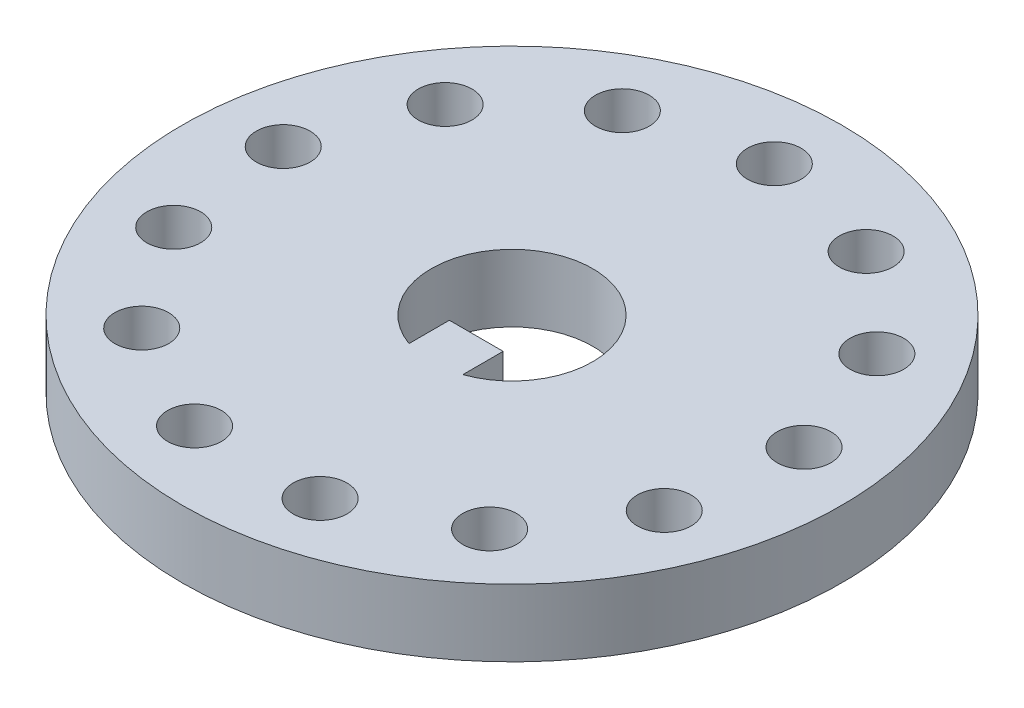
ISO-10303-21;
HEADER;
FILE_DESCRIPTION(('STEP AP214'),'2;1');
FILE_NAME('part.step','',(''),(''),'','','');
FILE_SCHEMA(('AUTOMOTIVE_DESIGN { 1 0 10303 214 1 1 1 1 }'));
ENDSEC;
DATA;
#1=APPLICATION_CONTEXT('core data for automotive mechanical design processes');
#2=APPLICATION_PROTOCOL_DEFINITION('international standard','automotive_design',2000,#1);
#3=PRODUCT_CONTEXT('',#1,'mechanical');
#4=PRODUCT('Part','Part','',(#3));
#5=PRODUCT_RELATED_PRODUCT_CATEGORY('part','',(#4));
#6=PRODUCT_DEFINITION_FORMATION('','',#4);
#7=PRODUCT_DEFINITION_CONTEXT('part definition',#1,'design');
#8=PRODUCT_DEFINITION('design','',#6,#7);
#9=PRODUCT_DEFINITION_SHAPE('','',#8);
#10=(LENGTH_UNIT() NAMED_UNIT(*) SI_UNIT(.MILLI.,.METRE.));
#11=(NAMED_UNIT(*) PLANE_ANGLE_UNIT() SI_UNIT($,.RADIAN.));
#12=(NAMED_UNIT(*) SI_UNIT($,.STERADIAN.) SOLID_ANGLE_UNIT());
#13=UNCERTAINTY_MEASURE_WITH_UNIT(LENGTH_MEASURE(1.E-05),#10,'distance_accuracy_value','');
#14=(GEOMETRIC_REPRESENTATION_CONTEXT(3) GLOBAL_UNCERTAINTY_ASSIGNED_CONTEXT((#13)) GLOBAL_UNIT_ASSIGNED_CONTEXT((#10,
#11,#12)) REPRESENTATION_CONTEXT('',''));
#15=CARTESIAN_POINT('',(0.,0.,0.));
#16=DIRECTION('',(0.,0.,1.));
#17=DIRECTION('',(1.,0.,0.));
#18=AXIS2_PLACEMENT_3D('',#15,#16,#17);
#19=CARTESIAN_POINT('',(0.,5.,0.));
#20=DIRECTION('',(0.,1.,0.));
#21=DIRECTION('',(0.,0.,1.));
#22=AXIS2_PLACEMENT_3D('',#19,#20,#21);
#23=PLANE('',#22);
#24=CARTESIAN_POINT('',(-16.0481853849258,5.,-11.0772625612566));
#25=DIRECTION('',(0.,1.,0.));
#26=DIRECTION('',(0.,0.,1.));
#27=AXIS2_PLACEMENT_3D('',#24,#25,#26);
#28=CIRCLE('',#27,2.);
#29=CARTESIAN_POINT('',(-16.0481853849258,5.,-9.07726256125663));
#30=VERTEX_POINT('',#29);
#31=EDGE_CURVE('E142',#30,#30,#28,.T.);
#32=ORIENTED_EDGE('',*,*,#31,.F.);
#33=EDGE_LOOP('',(#32));
#34=FACE_BOUND('',#33,.T.);
#35=CARTESIAN_POINT('',(-18.2328167323641,5.,6.91479529733048));
#36=DIRECTION('',(0.,1.,0.));
#37=DIRECTION('',(0.,0.,1.));
#38=AXIS2_PLACEMENT_3D('',#35,#36,#37);
#39=CIRCLE('',#38,2.);
#40=CARTESIAN_POINT('',(-18.2328167323641,5.,8.91479529733049));
#41=VERTEX_POINT('',#40);
#42=EDGE_CURVE('E146',#41,#41,#39,.T.);
#43=ORIENTED_EDGE('',*,*,#42,.F.);
#44=EDGE_LOOP('',(#43));
#45=FACE_BOUND('',#44,.T.);
#46=CARTESIAN_POINT('',(-4.66665545360519,5.,18.9333654398083));
#47=DIRECTION('',(0.,1.,0.));
#48=DIRECTION('',(0.,0.,1.));
#49=AXIS2_PLACEMENT_3D('',#46,#47,#48);
#50=CIRCLE('',#49,2.);
#51=CARTESIAN_POINT('',(-4.66665545360519,5.,20.9333654398083));
#52=VERTEX_POINT('',#51);
#53=EDGE_CURVE('E150',#52,#52,#50,.T.);
#54=ORIENTED_EDGE('',*,*,#53,.F.);
#55=EDGE_LOOP('',(#54));
#56=FACE_BOUND('',#55,.T.);
#57=CARTESIAN_POINT('',(12.9308918356974,5.,14.5959595893357));
#58=DIRECTION('',(0.,1.,0.));
#59=DIRECTION('',(0.,0.,1.));
#60=AXIS2_PLACEMENT_3D('',#57,#58,#59);
#61=CIRCLE('',#60,2.);
#62=CARTESIAN_POINT('',(12.9308918356974,5.,16.5959595893357));
#63=VERTEX_POINT('',#62);
#64=EDGE_CURVE('E154',#63,#63,#61,.T.);
#65=ORIENTED_EDGE('',*,*,#64,.F.);
#66=EDGE_LOOP('',(#65));
#67=FACE_BOUND('',#66,.T.);
#68=CARTESIAN_POINT('',(19.357823044913,5.,-2.3504652649799));
#69=DIRECTION('',(0.,1.,0.));
#70=DIRECTION('',(0.,0.,1.));
#71=AXIS2_PLACEMENT_3D('',#68,#69,#70);
#72=CIRCLE('',#71,2.);
#73=CARTESIAN_POINT('',(19.357823044913,5.,-0.350465264979899));
#74=VERTEX_POINT('',#73);
#75=EDGE_CURVE('E158',#74,#74,#72,.T.);
#76=ORIENTED_EDGE('',*,*,#75,.F.);
#77=EDGE_LOOP('',(#76));
#78=FACE_BOUND('',#77,.T.);
#79=CARTESIAN_POINT('',(9.0621018548536,5.,-17.2663925002381));
#80=DIRECTION('',(0.,1.,0.));
#81=DIRECTION('',(0.,0.,1.));
#82=AXIS2_PLACEMENT_3D('',#79,#80,#81);
#83=CIRCLE('',#82,2.);
#84=CARTESIAN_POINT('',(9.0621018548536,5.,-15.2663925002381));
#85=VERTEX_POINT('',#84);
#86=EDGE_CURVE('E104',#85,#85,#83,.T.);
#87=ORIENTED_EDGE('',*,*,#86,.F.);
#88=EDGE_LOOP('',(#87));
#89=FACE_BOUND('',#88,.T.);
#90=CARTESIAN_POINT('',(0.,5.,0.));
#91=DIRECTION('',(0.,1.,0.));
#92=DIRECTION('',(0.,0.,1.));
#93=AXIS2_PLACEMENT_3D('',#90,#91,#92);
#94=CIRCLE('',#93,24.5);
#95=CARTESIAN_POINT('',(0.,5.,24.5));
#96=VERTEX_POINT('',#95);
#97=EDGE_CURVE('E11',#96,#96,#94,.T.);
#98=ORIENTED_EDGE('',*,*,#97,.T.);
#99=EDGE_LOOP('',(#98));
#100=FACE_BOUND('',#99,.T.);
#101=CARTESIAN_POINT('',(0.,5.,-19.5));
#102=DIRECTION('',(0.,1.,0.));
#103=DIRECTION('',(0.,0.,1.));
#104=AXIS2_PLACEMENT_3D('',#101,#102,#103);
#105=CIRCLE('',#104,2.);
#106=CARTESIAN_POINT('',(0.,5.,-17.5));
#107=VERTEX_POINT('',#106);
#108=EDGE_CURVE('E114',#107,#107,#105,.T.);
#109=ORIENTED_EDGE('',*,*,#108,.F.);
#110=EDGE_LOOP('',(#109));
#111=FACE_BOUND('',#110,.T.);
#112=DIRECTION('',(0.,0.,-1.));
#113=VECTOR('',#112,1.);
#114=CARTESIAN_POINT('',(-2.,5.,2.65685424949238));
#115=LINE('',#114,#113);
#116=CARTESIAN_POINT('',(-2.,5.,5.65685424949238));
#117=VERTEX_POINT('',#116);
#118=CARTESIAN_POINT('',(-2.,5.,2.65685424949238));
#119=VERTEX_POINT('',#118);
#120=EDGE_CURVE('E83',#117,#119,#115,.T.);
#121=ORIENTED_EDGE('',*,*,#120,.F.);
#122=CARTESIAN_POINT('',(0.,5.,0.));
#123=DIRECTION('',(0.,1.,0.));
#124=DIRECTION('',(0.,0.,1.));
#125=AXIS2_PLACEMENT_3D('',#122,#123,#124);
#126=CIRCLE('',#125,6.);
#127=CARTESIAN_POINT('',(2.,5.,5.65685424949238));
#128=VERTEX_POINT('',#127);
#129=EDGE_CURVE('E75',#128,#117,#126,.T.);
#130=ORIENTED_EDGE('',*,*,#129,.F.);
#131=DIRECTION('',(0.,0.,1.));
#132=VECTOR('',#131,1.);
#133=CARTESIAN_POINT('',(2.,5.,5.65685424949238));
#134=LINE('',#133,#132);
#135=CARTESIAN_POINT('',(2.,5.,2.65685424949238));
#136=VERTEX_POINT('',#135);
#137=EDGE_CURVE('E98',#136,#128,#134,.T.);
#138=ORIENTED_EDGE('',*,*,#137,.F.);
#139=DIRECTION('',(1.,0.,0.));
#140=VECTOR('',#139,1.);
#141=CARTESIAN_POINT('',(2.,5.,2.65685424949238));
#142=LINE('',#141,#140);
#143=EDGE_CURVE('E96',#119,#136,#142,.T.);
#144=ORIENTED_EDGE('',*,*,#143,.F.);
#145=EDGE_LOOP('',(#121,#130,#138,#144));
#146=FACE_BOUND('',#145,.T.);
#147=CARTESIAN_POINT('',(16.0481853849268,5.,-11.0772625612584));
#148=DIRECTION('',(0.,1.,0.));
#149=DIRECTION('',(0.,0.,1.));
#150=AXIS2_PLACEMENT_3D('',#147,#148,#149);
#151=CIRCLE('',#150,2.);
#152=CARTESIAN_POINT('',(16.0481853849268,5.,-9.07726256125845));
#153=VERTEX_POINT('',#152);
#154=EDGE_CURVE('E249',#153,#153,#151,.T.);
#155=ORIENTED_EDGE('',*,*,#154,.F.);
#156=EDGE_LOOP('',(#155));
#157=FACE_BOUND('',#156,.T.);
#158=CARTESIAN_POINT('',(18.2328167323671,5.,6.91479529732841));
#159=DIRECTION('',(0.,1.,0.));
#160=DIRECTION('',(0.,0.,1.));
#161=AXIS2_PLACEMENT_3D('',#158,#159,#160);
#162=CIRCLE('',#161,2.);
#163=CARTESIAN_POINT('',(18.2328167323671,5.,8.91479529732841));
#164=VERTEX_POINT('',#163);
#165=EDGE_CURVE('E243',#164,#164,#162,.T.);
#166=ORIENTED_EDGE('',*,*,#165,.F.);
#167=EDGE_LOOP('',(#166));
#168=FACE_BOUND('',#167,.T.);
#169=CARTESIAN_POINT('',(4.66665545360956,5.,18.9333654398078));
#170=DIRECTION('',(0.,1.,0.));
#171=DIRECTION('',(0.,0.,1.));
#172=AXIS2_PLACEMENT_3D('',#169,#170,#171);
#173=CIRCLE('',#172,2.);
#174=CARTESIAN_POINT('',(4.66665545360956,5.,20.9333654398078));
#175=VERTEX_POINT('',#174);
#176=EDGE_CURVE('E237',#175,#175,#173,.T.);
#177=ORIENTED_EDGE('',*,*,#176,.F.);
#178=EDGE_LOOP('',(#177));
#179=FACE_BOUND('',#178,.T.);
#180=CARTESIAN_POINT('',(-12.9308918356936,5.,14.5959595893372));
#181=DIRECTION('',(0.,1.,0.));
#182=DIRECTION('',(0.,0.,1.));
#183=AXIS2_PLACEMENT_3D('',#180,#181,#182);
#184=CIRCLE('',#183,2.);
#185=CARTESIAN_POINT('',(-12.9308918356936,5.,16.5959595893372));
#186=VERTEX_POINT('',#185);
#187=EDGE_CURVE('E231',#186,#186,#184,.T.);
#188=ORIENTED_EDGE('',*,*,#187,.F.);
#189=EDGE_LOOP('',(#188));
#190=FACE_BOUND('',#189,.T.);
#191=CARTESIAN_POINT('',(-19.3578230449111,5.,-2.35046526497769));
#192=DIRECTION('',(0.,1.,0.));
#193=DIRECTION('',(0.,0.,1.));
#194=AXIS2_PLACEMENT_3D('',#191,#192,#193);
#195=CIRCLE('',#194,2.);
#196=CARTESIAN_POINT('',(-19.3578230449111,5.,-0.35046526497769));
#197=VERTEX_POINT('',#196);
#198=EDGE_CURVE('E225',#197,#197,#195,.T.);
#199=ORIENTED_EDGE('',*,*,#198,.F.);
#200=EDGE_LOOP('',(#199));
#201=FACE_BOUND('',#200,.T.);
#202=CARTESIAN_POINT('',(-9.06210185485337,5.,-17.2663925002371));
#203=DIRECTION('',(0.,1.,0.));
#204=DIRECTION('',(0.,0.,1.));
#205=AXIS2_PLACEMENT_3D('',#202,#203,#204);
#206=CIRCLE('',#205,2.);
#207=CARTESIAN_POINT('',(-9.06210185485337,5.,-15.2663925002371));
#208=VERTEX_POINT('',#207);
#209=EDGE_CURVE('E218',#208,#208,#206,.T.);
#210=ORIENTED_EDGE('',*,*,#209,.F.);
#211=EDGE_LOOP('',(#210));
#212=FACE_BOUND('',#211,.T.);
#213=ADVANCED_FACE('F34',(#34,#45,#56,#67,#78,#89,#100,#111,#146,#157,#168,#179,#190,#201,#212),
#23,.T.);
#214=CARTESIAN_POINT('',(0.,0.,0.));
#215=DIRECTION('',(0.,1.,0.));
#216=DIRECTION('',(0.,0.,1.));
#217=AXIS2_PLACEMENT_3D('',#214,#215,#216);
#218=PLANE('',#217);
#219=CARTESIAN_POINT('',(0.,0.,-19.5));
#220=DIRECTION('',(0.,1.,0.));
#221=DIRECTION('',(0.,0.,1.));
#222=AXIS2_PLACEMENT_3D('',#219,#220,#221);
#223=CIRCLE('',#222,2.);
#224=CARTESIAN_POINT('',(0.,0.,-17.5));
#225=VERTEX_POINT('',#224);
#226=EDGE_CURVE('E91',#225,#225,#223,.T.);
#227=ORIENTED_EDGE('',*,*,#226,.T.);
#228=EDGE_LOOP('',(#227));
#229=FACE_BOUND('',#228,.T.);
#230=CARTESIAN_POINT('',(0.,0.,0.));
#231=DIRECTION('',(0.,1.,0.));
#232=DIRECTION('',(0.,0.,1.));
#233=AXIS2_PLACEMENT_3D('',#230,#231,#232);
#234=CIRCLE('',#233,24.5);
#235=CARTESIAN_POINT('',(0.,0.,24.5));
#236=VERTEX_POINT('',#235);
#237=EDGE_CURVE('E38',#236,#236,#234,.T.);
#238=ORIENTED_EDGE('',*,*,#237,.F.);
#239=EDGE_LOOP('',(#238));
#240=FACE_BOUND('',#239,.T.);
#241=CARTESIAN_POINT('',(0.,0.,0.));
#242=DIRECTION('',(0.,1.,0.));
#243=DIRECTION('',(0.,0.,1.));
#244=AXIS2_PLACEMENT_3D('',#241,#242,#243);
#245=CIRCLE('',#244,6.);
#246=CARTESIAN_POINT('',(2.,0.,5.65685424949238));
#247=VERTEX_POINT('',#246);
#248=CARTESIAN_POINT('',(-2.,0.,5.65685424949238));
#249=VERTEX_POINT('',#248);
#250=EDGE_CURVE('E57',#247,#249,#245,.T.);
#251=ORIENTED_EDGE('',*,*,#250,.T.);
#252=DIRECTION('',(0.,0.,-1.));
#253=VECTOR('',#252,1.);
#254=CARTESIAN_POINT('',(-2.,0.,2.65685424949238));
#255=LINE('',#254,#253);
#256=CARTESIAN_POINT('',(-2.,0.,2.65685424949238));
#257=VERTEX_POINT('',#256);
#258=EDGE_CURVE('E90',#249,#257,#255,.T.);
#259=ORIENTED_EDGE('',*,*,#258,.T.);
#260=DIRECTION('',(1.,0.,0.));
#261=VECTOR('',#260,1.);
#262=CARTESIAN_POINT('',(2.,0.,2.65685424949238));
#263=LINE('',#262,#261);
#264=CARTESIAN_POINT('',(2.,0.,2.65685424949238));
#265=VERTEX_POINT('',#264);
#266=EDGE_CURVE('E106',#257,#265,#263,.T.);
#267=ORIENTED_EDGE('',*,*,#266,.T.);
#268=DIRECTION('',(0.,0.,1.));
#269=VECTOR('',#268,1.);
#270=CARTESIAN_POINT('',(2.,0.,5.65685424949238));
#271=LINE('',#270,#269);
#272=EDGE_CURVE('E84',#265,#247,#271,.T.);
#273=ORIENTED_EDGE('',*,*,#272,.T.);
#274=EDGE_LOOP('',(#251,#259,#267,#273));
#275=FACE_BOUND('',#274,.T.);
#276=CARTESIAN_POINT('',(9.0621018548536,0.,-17.2663925002381));
#277=DIRECTION('',(0.,1.,0.));
#278=DIRECTION('',(0.,0.,1.));
#279=AXIS2_PLACEMENT_3D('',#276,#277,#278);
#280=CIRCLE('',#279,2.);
#281=CARTESIAN_POINT('',(9.0621018548536,0.,-15.2663925002381));
#282=VERTEX_POINT('',#281);
#283=EDGE_CURVE('E173',#282,#282,#280,.T.);
#284=ORIENTED_EDGE('',*,*,#283,.T.);
#285=EDGE_LOOP('',(#284));
#286=FACE_BOUND('',#285,.T.);
#287=CARTESIAN_POINT('',(16.0481853849268,0.,-11.0772625612584));
#288=DIRECTION('',(0.,1.,0.));
#289=DIRECTION('',(0.,0.,1.));
#290=AXIS2_PLACEMENT_3D('',#287,#288,#289);
#291=CIRCLE('',#290,2.);
#292=CARTESIAN_POINT('',(16.0481853849268,0.,-9.07726256125845));
#293=VERTEX_POINT('',#292);
#294=EDGE_CURVE('E177',#293,#293,#291,.T.);
#295=ORIENTED_EDGE('',*,*,#294,.T.);
#296=EDGE_LOOP('',(#295));
#297=FACE_BOUND('',#296,.T.);
#298=CARTESIAN_POINT('',(19.357823044913,0.,-2.3504652649799));
#299=DIRECTION('',(0.,1.,0.));
#300=DIRECTION('',(0.,0.,1.));
#301=AXIS2_PLACEMENT_3D('',#298,#299,#300);
#302=CIRCLE('',#301,2.);
#303=CARTESIAN_POINT('',(19.357823044913,0.,-0.350465264979899));
#304=VERTEX_POINT('',#303);
#305=EDGE_CURVE('E181',#304,#304,#302,.T.);
#306=ORIENTED_EDGE('',*,*,#305,.T.);
#307=EDGE_LOOP('',(#306));
#308=FACE_BOUND('',#307,.T.);
#309=CARTESIAN_POINT('',(18.2328167323671,0.,6.91479529732841));
#310=DIRECTION('',(0.,1.,0.));
#311=DIRECTION('',(0.,0.,1.));
#312=AXIS2_PLACEMENT_3D('',#309,#310,#311);
#313=CIRCLE('',#312,2.);
#314=CARTESIAN_POINT('',(18.2328167323671,0.,8.91479529732841));
#315=VERTEX_POINT('',#314);
#316=EDGE_CURVE('E185',#315,#315,#313,.T.);
#317=ORIENTED_EDGE('',*,*,#316,.T.);
#318=EDGE_LOOP('',(#317));
#319=FACE_BOUND('',#318,.T.);
#320=CARTESIAN_POINT('',(12.9308918356974,0.,14.5959595893357));
#321=DIRECTION('',(0.,1.,0.));
#322=DIRECTION('',(0.,0.,1.));
#323=AXIS2_PLACEMENT_3D('',#320,#321,#322);
#324=CIRCLE('',#323,2.);
#325=CARTESIAN_POINT('',(12.9308918356974,0.,16.5959595893357));
#326=VERTEX_POINT('',#325);
#327=EDGE_CURVE('E189',#326,#326,#324,.T.);
#328=ORIENTED_EDGE('',*,*,#327,.T.);
#329=EDGE_LOOP('',(#328));
#330=FACE_BOUND('',#329,.T.);
#331=CARTESIAN_POINT('',(4.66665545360956,0.,18.9333654398078));
#332=DIRECTION('',(0.,1.,0.));
#333=DIRECTION('',(0.,0.,1.));
#334=AXIS2_PLACEMENT_3D('',#331,#332,#333);
#335=CIRCLE('',#334,2.);
#336=CARTESIAN_POINT('',(4.66665545360956,0.,20.9333654398078));
#337=VERTEX_POINT('',#336);
#338=EDGE_CURVE('E193',#337,#337,#335,.T.);
#339=ORIENTED_EDGE('',*,*,#338,.T.);
#340=EDGE_LOOP('',(#339));
#341=FACE_BOUND('',#340,.T.);
#342=CARTESIAN_POINT('',(-4.66665545360519,0.,18.9333654398083));
#343=DIRECTION('',(0.,1.,0.));
#344=DIRECTION('',(0.,0.,1.));
#345=AXIS2_PLACEMENT_3D('',#342,#343,#344);
#346=CIRCLE('',#345,2.);
#347=CARTESIAN_POINT('',(-4.66665545360519,0.,20.9333654398083));
#348=VERTEX_POINT('',#347);
#349=EDGE_CURVE('E197',#348,#348,#346,.T.);
#350=ORIENTED_EDGE('',*,*,#349,.T.);
#351=EDGE_LOOP('',(#350));
#352=FACE_BOUND('',#351,.T.);
#353=CARTESIAN_POINT('',(-12.9308918356936,0.,14.5959595893372));
#354=DIRECTION('',(0.,1.,0.));
#355=DIRECTION('',(0.,0.,1.));
#356=AXIS2_PLACEMENT_3D('',#353,#354,#355);
#357=CIRCLE('',#356,2.);
#358=CARTESIAN_POINT('',(-12.9308918356936,0.,16.5959595893372));
#359=VERTEX_POINT('',#358);
#360=EDGE_CURVE('E201',#359,#359,#357,.T.);
#361=ORIENTED_EDGE('',*,*,#360,.T.);
#362=EDGE_LOOP('',(#361));
#363=FACE_BOUND('',#362,.T.);
#364=CARTESIAN_POINT('',(-18.2328167323641,0.,6.91479529733048));
#365=DIRECTION('',(0.,1.,0.));
#366=DIRECTION('',(0.,0.,1.));
#367=AXIS2_PLACEMENT_3D('',#364,#365,#366);
#368=CIRCLE('',#367,2.);
#369=CARTESIAN_POINT('',(-18.2328167323641,0.,8.91479529733049));
#370=VERTEX_POINT('',#369);
#371=EDGE_CURVE('E205',#370,#370,#368,.T.);
#372=ORIENTED_EDGE('',*,*,#371,.T.);
#373=EDGE_LOOP('',(#372));
#374=FACE_BOUND('',#373,.T.);
#375=CARTESIAN_POINT('',(-19.3578230449111,0.,-2.35046526497769));
#376=DIRECTION('',(0.,1.,0.));
#377=DIRECTION('',(0.,0.,1.));
#378=AXIS2_PLACEMENT_3D('',#375,#376,#377);
#379=CIRCLE('',#378,2.);
#380=CARTESIAN_POINT('',(-19.3578230449111,0.,-0.35046526497769));
#381=VERTEX_POINT('',#380);
#382=EDGE_CURVE('E209',#381,#381,#379,.T.);
#383=ORIENTED_EDGE('',*,*,#382,.T.);
#384=EDGE_LOOP('',(#383));
#385=FACE_BOUND('',#384,.T.);
#386=CARTESIAN_POINT('',(-16.0481853849258,0.,-11.0772625612566));
#387=DIRECTION('',(0.,1.,0.));
#388=DIRECTION('',(0.,0.,1.));
#389=AXIS2_PLACEMENT_3D('',#386,#387,#388);
#390=CIRCLE('',#389,2.);
#391=CARTESIAN_POINT('',(-16.0481853849258,0.,-9.07726256125663));
#392=VERTEX_POINT('',#391);
#393=EDGE_CURVE('E213',#392,#392,#390,.T.);
#394=ORIENTED_EDGE('',*,*,#393,.T.);
#395=EDGE_LOOP('',(#394));
#396=FACE_BOUND('',#395,.T.);
#397=CARTESIAN_POINT('',(-9.06210185485337,0.,-17.2663925002371));
#398=DIRECTION('',(0.,1.,0.));
#399=DIRECTION('',(0.,0.,1.));
#400=AXIS2_PLACEMENT_3D('',#397,#398,#399);
#401=CIRCLE('',#400,2.);
#402=CARTESIAN_POINT('',(-9.06210185485337,0.,-15.2663925002371));
#403=VERTEX_POINT('',#402);
#404=EDGE_CURVE('E216',#403,#403,#401,.T.);
#405=ORIENTED_EDGE('',*,*,#404,.T.);
#406=EDGE_LOOP('',(#405));
#407=FACE_BOUND('',#406,.T.);
#408=ADVANCED_FACE('F120',(#229,#240,#275,#286,#297,#308,#319,#330,#341,#352,#363,#374,#385,
#396,#407),#218,.F.);
#409=CARTESIAN_POINT('',(0.,5.,0.));
#410=DIRECTION('',(0.,-1.,0.));
#411=DIRECTION('',(0.,0.,-1.));
#412=AXIS2_PLACEMENT_3D('',#409,#410,#411);
#413=CYLINDRICAL_SURFACE('',#412,24.5);
#414=ORIENTED_EDGE('',*,*,#97,.F.);
#415=EDGE_LOOP('',(#414));
#416=FACE_BOUND('',#415,.T.);
#417=ORIENTED_EDGE('',*,*,#237,.T.);
#418=EDGE_LOOP('',(#417));
#419=FACE_BOUND('',#418,.T.);
#420=ADVANCED_FACE('F36',(#416,#419),#413,.T.);
#421=CARTESIAN_POINT('',(0.,5.,-19.5));
#422=DIRECTION('',(0.,-1.,0.));
#423=DIRECTION('',(0.,0.,-1.));
#424=AXIS2_PLACEMENT_3D('',#421,#422,#423);
#425=CYLINDRICAL_SURFACE('',#424,2.);
#426=ORIENTED_EDGE('',*,*,#108,.T.);
#427=EDGE_LOOP('',(#426));
#428=FACE_BOUND('',#427,.T.);
#429=ORIENTED_EDGE('',*,*,#226,.F.);
#430=EDGE_LOOP('',(#429));
#431=FACE_BOUND('',#430,.T.);
#432=ADVANCED_FACE('F123',(#428,#431),#425,.F.);
#433=CARTESIAN_POINT('',(0.,5.,0.));
#434=DIRECTION('',(0.,-1.,0.));
#435=DIRECTION('',(0.,0.,-1.));
#436=AXIS2_PLACEMENT_3D('',#433,#434,#435);
#437=CYLINDRICAL_SURFACE('',#436,6.);
#438=ORIENTED_EDGE('',*,*,#250,.F.);
#439=DIRECTION('',(0.,-1.,0.));
#440=VECTOR('',#439,1.);
#441=CARTESIAN_POINT('',(2.,5.,5.65685424949238));
#442=LINE('',#441,#440);
#443=EDGE_CURVE('E79',#128,#247,#442,.T.);
#444=ORIENTED_EDGE('',*,*,#443,.F.);
#445=ORIENTED_EDGE('',*,*,#129,.T.);
#446=DIRECTION('',(0.,-1.,0.));
#447=VECTOR('',#446,1.);
#448=CARTESIAN_POINT('',(-2.,5.,5.65685424949238));
#449=LINE('',#448,#447);
#450=EDGE_CURVE('E78',#117,#249,#449,.T.);
#451=ORIENTED_EDGE('',*,*,#450,.T.);
#452=EDGE_LOOP('',(#438,#444,#445,#451));
#453=FACE_BOUND('',#452,.T.);
#454=ADVANCED_FACE('F77',(#453),#437,.F.);
#455=CARTESIAN_POINT('',(-2.,5.,2.65685424949238));
#456=DIRECTION('',(-1.,0.,0.));
#457=DIRECTION('',(0.,0.,1.));
#458=AXIS2_PLACEMENT_3D('',#455,#456,#457);
#459=PLANE('',#458);
#460=ORIENTED_EDGE('',*,*,#258,.F.);
#461=ORIENTED_EDGE('',*,*,#450,.F.);
#462=ORIENTED_EDGE('',*,*,#120,.T.);
#463=DIRECTION('',(0.,-1.,0.));
#464=VECTOR('',#463,1.);
#465=CARTESIAN_POINT('',(-2.,5.,2.65685424949238));
#466=LINE('',#465,#464);
#467=EDGE_CURVE('E92',#119,#257,#466,.T.);
#468=ORIENTED_EDGE('',*,*,#467,.T.);
#469=EDGE_LOOP('',(#460,#461,#462,#468));
#470=FACE_BOUND('',#469,.T.);
#471=ADVANCED_FACE('F87',(#470),#459,.T.);
#472=CARTESIAN_POINT('',(2.,5.,2.65685424949238));
#473=DIRECTION('',(0.,0.,-1.));
#474=DIRECTION('',(-1.,0.,0.));
#475=AXIS2_PLACEMENT_3D('',#472,#473,#474);
#476=PLANE('',#475);
#477=ORIENTED_EDGE('',*,*,#266,.F.);
#478=ORIENTED_EDGE('',*,*,#467,.F.);
#479=ORIENTED_EDGE('',*,*,#143,.T.);
#480=DIRECTION('',(0.,-1.,0.));
#481=VECTOR('',#480,1.);
#482=CARTESIAN_POINT('',(2.,5.,2.65685424949238));
#483=LINE('',#482,#481);
#484=EDGE_CURVE('E49',#136,#265,#483,.T.);
#485=ORIENTED_EDGE('',*,*,#484,.T.);
#486=EDGE_LOOP('',(#477,#478,#479,#485));
#487=FACE_BOUND('',#486,.T.);
#488=ADVANCED_FACE('F267',(#487),#476,.T.);
#489=CARTESIAN_POINT('',(2.,5.,5.65685424949238));
#490=DIRECTION('',(1.,0.,0.));
#491=DIRECTION('',(0.,0.,-1.));
#492=AXIS2_PLACEMENT_3D('',#489,#490,#491);
#493=PLANE('',#492);
#494=ORIENTED_EDGE('',*,*,#272,.F.);
#495=ORIENTED_EDGE('',*,*,#484,.F.);
#496=ORIENTED_EDGE('',*,*,#137,.T.);
#497=ORIENTED_EDGE('',*,*,#443,.T.);
#498=EDGE_LOOP('',(#494,#495,#496,#497));
#499=FACE_BOUND('',#498,.T.);
#500=ADVANCED_FACE('F258',(#499),#493,.T.);
#501=CARTESIAN_POINT('',(9.0621018548536,5.,-17.2663925002381));
#502=DIRECTION('',(0.,-1.,0.));
#503=DIRECTION('',(0.,0.,-1.));
#504=AXIS2_PLACEMENT_3D('',#501,#502,#503);
#505=CYLINDRICAL_SURFACE('',#504,2.);
#506=ORIENTED_EDGE('',*,*,#86,.T.);
#507=EDGE_LOOP('',(#506));
#508=FACE_BOUND('',#507,.T.);
#509=ORIENTED_EDGE('',*,*,#283,.F.);
#510=EDGE_LOOP('',(#509));
#511=FACE_BOUND('',#510,.T.);
#512=ADVANCED_FACE('F254',(#508,#511),#505,.F.);
#513=CARTESIAN_POINT('',(16.0481853849268,5.,-11.0772625612584));
#514=DIRECTION('',(0.,-1.,0.));
#515=DIRECTION('',(0.,0.,-1.));
#516=AXIS2_PLACEMENT_3D('',#513,#514,#515);
#517=CYLINDRICAL_SURFACE('',#516,2.);
#518=ORIENTED_EDGE('',*,*,#154,.T.);
#519=EDGE_LOOP('',(#518));
#520=FACE_BOUND('',#519,.T.);
#521=ORIENTED_EDGE('',*,*,#294,.F.);
#522=EDGE_LOOP('',(#521));
#523=FACE_BOUND('',#522,.T.);
#524=ADVANCED_FACE('F257',(#520,#523),#517,.F.);
#525=CARTESIAN_POINT('',(19.357823044913,5.,-2.3504652649799));
#526=DIRECTION('',(0.,-1.,0.));
#527=DIRECTION('',(0.,0.,-1.));
#528=AXIS2_PLACEMENT_3D('',#525,#526,#527);
#529=CYLINDRICAL_SURFACE('',#528,2.);
#530=ORIENTED_EDGE('',*,*,#75,.T.);
#531=EDGE_LOOP('',(#530));
#532=FACE_BOUND('',#531,.T.);
#533=ORIENTED_EDGE('',*,*,#305,.F.);
#534=EDGE_LOOP('',(#533));
#535=FACE_BOUND('',#534,.T.);
#536=ADVANCED_FACE('F264',(#532,#535),#529,.F.);
#537=CARTESIAN_POINT('',(18.2328167323671,5.,6.91479529732841));
#538=DIRECTION('',(0.,-1.,0.));
#539=DIRECTION('',(0.,0.,-1.));
#540=AXIS2_PLACEMENT_3D('',#537,#538,#539);
#541=CYLINDRICAL_SURFACE('',#540,2.);
#542=ORIENTED_EDGE('',*,*,#165,.T.);
#543=EDGE_LOOP('',(#542));
#544=FACE_BOUND('',#543,.T.);
#545=ORIENTED_EDGE('',*,*,#316,.F.);
#546=EDGE_LOOP('',(#545));
#547=FACE_BOUND('',#546,.T.);
#548=ADVANCED_FACE('F306',(#544,#547),#541,.F.);
#549=CARTESIAN_POINT('',(12.9308918356974,5.,14.5959595893357));
#550=DIRECTION('',(0.,-1.,0.));
#551=DIRECTION('',(0.,0.,-1.));
#552=AXIS2_PLACEMENT_3D('',#549,#550,#551);
#553=CYLINDRICAL_SURFACE('',#552,2.);
#554=ORIENTED_EDGE('',*,*,#64,.T.);
#555=EDGE_LOOP('',(#554));
#556=FACE_BOUND('',#555,.T.);
#557=ORIENTED_EDGE('',*,*,#327,.F.);
#558=EDGE_LOOP('',(#557));
#559=FACE_BOUND('',#558,.T.);
#560=ADVANCED_FACE('F315',(#556,#559),#553,.F.);
#561=CARTESIAN_POINT('',(4.66665545360956,5.,18.9333654398078));
#562=DIRECTION('',(0.,-1.,0.));
#563=DIRECTION('',(0.,0.,-1.));
#564=AXIS2_PLACEMENT_3D('',#561,#562,#563);
#565=CYLINDRICAL_SURFACE('',#564,2.);
#566=ORIENTED_EDGE('',*,*,#176,.T.);
#567=EDGE_LOOP('',(#566));
#568=FACE_BOUND('',#567,.T.);
#569=ORIENTED_EDGE('',*,*,#338,.F.);
#570=EDGE_LOOP('',(#569));
#571=FACE_BOUND('',#570,.T.);
#572=ADVANCED_FACE('F325',(#568,#571),#565,.F.);
#573=CARTESIAN_POINT('',(-4.66665545360519,5.,18.9333654398083));
#574=DIRECTION('',(0.,-1.,0.));
#575=DIRECTION('',(0.,0.,-1.));
#576=AXIS2_PLACEMENT_3D('',#573,#574,#575);
#577=CYLINDRICAL_SURFACE('',#576,2.);
#578=ORIENTED_EDGE('',*,*,#53,.T.);
#579=EDGE_LOOP('',(#578));
#580=FACE_BOUND('',#579,.T.);
#581=ORIENTED_EDGE('',*,*,#349,.F.);
#582=EDGE_LOOP('',(#581));
#583=FACE_BOUND('',#582,.T.);
#584=ADVANCED_FACE('F335',(#580,#583),#577,.F.);
#585=CARTESIAN_POINT('',(-12.9308918356936,5.,14.5959595893372));
#586=DIRECTION('',(0.,-1.,0.));
#587=DIRECTION('',(0.,0.,-1.));
#588=AXIS2_PLACEMENT_3D('',#585,#586,#587);
#589=CYLINDRICAL_SURFACE('',#588,2.);
#590=ORIENTED_EDGE('',*,*,#187,.T.);
#591=EDGE_LOOP('',(#590));
#592=FACE_BOUND('',#591,.T.);
#593=ORIENTED_EDGE('',*,*,#360,.F.);
#594=EDGE_LOOP('',(#593));
#595=FACE_BOUND('',#594,.T.);
#596=ADVANCED_FACE('F345',(#592,#595),#589,.F.);
#597=CARTESIAN_POINT('',(-18.2328167323641,5.,6.91479529733048));
#598=DIRECTION('',(0.,-1.,0.));
#599=DIRECTION('',(0.,0.,-1.));
#600=AXIS2_PLACEMENT_3D('',#597,#598,#599);
#601=CYLINDRICAL_SURFACE('',#600,2.);
#602=ORIENTED_EDGE('',*,*,#42,.T.);
#603=EDGE_LOOP('',(#602));
#604=FACE_BOUND('',#603,.T.);
#605=ORIENTED_EDGE('',*,*,#371,.F.);
#606=EDGE_LOOP('',(#605));
#607=FACE_BOUND('',#606,.T.);
#608=ADVANCED_FACE('F355',(#604,#607),#601,.F.);
#609=CARTESIAN_POINT('',(-19.3578230449111,5.,-2.35046526497769));
#610=DIRECTION('',(0.,-1.,0.));
#611=DIRECTION('',(0.,0.,-1.));
#612=AXIS2_PLACEMENT_3D('',#609,#610,#611);
#613=CYLINDRICAL_SURFACE('',#612,2.);
#614=ORIENTED_EDGE('',*,*,#198,.T.);
#615=EDGE_LOOP('',(#614));
#616=FACE_BOUND('',#615,.T.);
#617=ORIENTED_EDGE('',*,*,#382,.F.);
#618=EDGE_LOOP('',(#617));
#619=FACE_BOUND('',#618,.T.);
#620=ADVANCED_FACE('F365',(#616,#619),#613,.F.);
#621=CARTESIAN_POINT('',(-16.0481853849258,5.,-11.0772625612566));
#622=DIRECTION('',(0.,-1.,0.));
#623=DIRECTION('',(0.,0.,-1.));
#624=AXIS2_PLACEMENT_3D('',#621,#622,#623);
#625=CYLINDRICAL_SURFACE('',#624,2.);
#626=ORIENTED_EDGE('',*,*,#31,.T.);
#627=EDGE_LOOP('',(#626));
#628=FACE_BOUND('',#627,.T.);
#629=ORIENTED_EDGE('',*,*,#393,.F.);
#630=EDGE_LOOP('',(#629));
#631=FACE_BOUND('',#630,.T.);
#632=ADVANCED_FACE('F375',(#628,#631),#625,.F.);
#633=CARTESIAN_POINT('',(-9.06210185485337,5.,-17.2663925002371));
#634=DIRECTION('',(0.,-1.,0.));
#635=DIRECTION('',(0.,0.,-1.));
#636=AXIS2_PLACEMENT_3D('',#633,#634,#635);
#637=CYLINDRICAL_SURFACE('',#636,2.);
#638=ORIENTED_EDGE('',*,*,#209,.T.);
#639=EDGE_LOOP('',(#638));
#640=FACE_BOUND('',#639,.T.);
#641=ORIENTED_EDGE('',*,*,#404,.F.);
#642=EDGE_LOOP('',(#641));
#643=FACE_BOUND('',#642,.T.);
#644=ADVANCED_FACE('F385',(#640,#643),#637,.F.);
#645=CLOSED_SHELL('',(#213,#408,#420,#432,#454,#471,#488,#500,#512,#524,#536,#548,#560,#572,
#584,#596,#608,#620,#632,#644));
#646=MANIFOLD_SOLID_BREP('B2',#645);
#647=ADVANCED_BREP_SHAPE_REPRESENTATION('',(#18,#646),#14);
#648=SHAPE_DEFINITION_REPRESENTATION(#9,#647);
ENDSEC;
END-ISO-10303-21;
